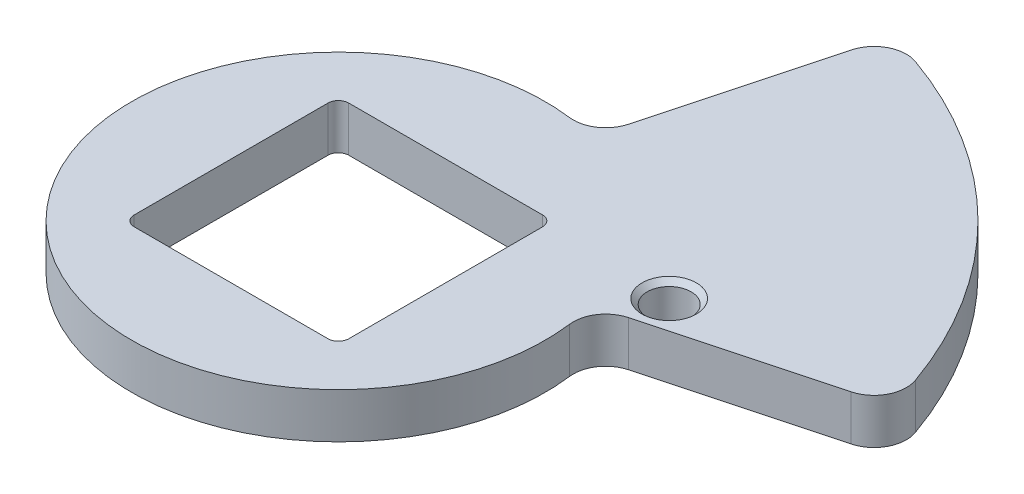
ISO-10303-21;
HEADER;
FILE_DESCRIPTION(('STEP AP214'),'2;1');
FILE_NAME('part.step','',(''),(''),'','','');
FILE_SCHEMA(('AUTOMOTIVE_DESIGN { 1 0 10303 214 1 1 1 1 }'));
ENDSEC;
DATA;
#1=APPLICATION_CONTEXT('core data for automotive mechanical design processes');
#2=APPLICATION_PROTOCOL_DEFINITION('international standard','automotive_design',2000,#1);
#3=PRODUCT_CONTEXT('',#1,'mechanical');
#4=PRODUCT('Part','Part','',(#3));
#5=PRODUCT_RELATED_PRODUCT_CATEGORY('part','',(#4));
#6=PRODUCT_DEFINITION_FORMATION('','',#4);
#7=PRODUCT_DEFINITION_CONTEXT('part definition',#1,'design');
#8=PRODUCT_DEFINITION('design','',#6,#7);
#9=PRODUCT_DEFINITION_SHAPE('','',#8);
#10=(LENGTH_UNIT() NAMED_UNIT(*) SI_UNIT(.MILLI.,.METRE.));
#11=(NAMED_UNIT(*) PLANE_ANGLE_UNIT() SI_UNIT($,.RADIAN.));
#12=(NAMED_UNIT(*) SI_UNIT($,.STERADIAN.) SOLID_ANGLE_UNIT());
#13=UNCERTAINTY_MEASURE_WITH_UNIT(LENGTH_MEASURE(1.E-05),#10,'distance_accuracy_value','');
#14=(GEOMETRIC_REPRESENTATION_CONTEXT(3) GLOBAL_UNCERTAINTY_ASSIGNED_CONTEXT((#13)) GLOBAL_UNIT_ASSIGNED_CONTEXT((#10,
#11,#12)) REPRESENTATION_CONTEXT('',''));
#15=CARTESIAN_POINT('',(0.,0.,0.));
#16=DIRECTION('',(0.,0.,1.));
#17=DIRECTION('',(1.,0.,0.));
#18=AXIS2_PLACEMENT_3D('',#15,#16,#17);
#19=CARTESIAN_POINT('',(0.,4.445,0.));
#20=DIRECTION('',(0.,-1.,0.));
#21=DIRECTION('',(0.,0.,-1.));
#22=AXIS2_PLACEMENT_3D('',#19,#20,#21);
#23=PLANE('',#22);
#24=CARTESIAN_POINT('',(22.86,4.445,-9.652));
#25=DIRECTION('',(0.,-1.,0.));
#26=DIRECTION('',(0.,0.,-1.));
#27=AXIS2_PLACEMENT_3D('',#24,#25,#26);
#28=CIRCLE('',#27,2.66700000000002);
#29=CARTESIAN_POINT('',(22.86,4.445,-12.319));
#30=VERTEX_POINT('',#29);
#31=EDGE_CURVE('E11',#30,#30,#28,.T.);
#32=ORIENTED_EDGE('',*,*,#31,.T.);
#33=EDGE_LOOP('',(#32));
#34=FACE_BOUND('',#33,.T.);
#35=CARTESIAN_POINT('',(0.,4.445,0.));
#36=DIRECTION('',(0.,1.,0.));
#37=DIRECTION('',(0.,0.,-1.));
#38=AXIS2_PLACEMENT_3D('',#35,#36,#37);
#39=CIRCLE('',#38,44.45);
#40=CARTESIAN_POINT('',(41.9232246474188,4.445,-14.773142359094));
#41=VERTEX_POINT('',#40);
#42=CARTESIAN_POINT('',(14.7731423590938,4.445,-41.9232246474188));
#43=VERTEX_POINT('',#42);
#44=EDGE_CURVE('E190',#41,#43,#39,.T.);
#45=ORIENTED_EDGE('',*,*,#44,.T.);
#46=CARTESIAN_POINT('',(13.7179179048728,4.445,-38.9287086011747));
#47=DIRECTION('',(0.,-1.,0.));
#48=DIRECTION('',(0.,0.,-1.));
#49=AXIS2_PLACEMENT_3D('',#46,#47,#48);
#50=CIRCLE('',#49,3.175);
#51=CARTESIAN_POINT('',(10.651103406405,4.445,-39.7504590693751));
#52=VERTEX_POINT('',#51);
#53=EDGE_CURVE('E199',#43,#52,#50,.F.);
#54=ORIENTED_EDGE('',*,*,#53,.T.);
#55=DIRECTION('',(-0.258819045102511,0.,0.965925826289071));
#56=VECTOR('',#55,1.);
#57=CARTESIAN_POINT('',(11.5045065548066,4.445,-42.9354029785492));
#58=LINE('',#57,#56);
#59=CARTESIAN_POINT('',(6.0251739566305,4.445,-22.4862553305868));
#60=VERTEX_POINT('',#59);
#61=EDGE_CURVE('E172',#52,#60,#58,.T.);
#62=ORIENTED_EDGE('',*,*,#61,.T.);
#63=CARTESIAN_POINT('',(2.9583594581627,4.445,-23.3080057987872));
#64=DIRECTION('',(0.,-1.,0.));
#65=DIRECTION('',(0.,0.,-1.));
#66=AXIS2_PLACEMENT_3D('',#63,#64,#65);
#67=CIRCLE('',#66,3.175);
#68=CARTESIAN_POINT('',(2.55858115300558,4.445,-20.1582752854376));
#69=VERTEX_POINT('',#68);
#70=EDGE_CURVE('E212',#60,#69,#67,.T.);
#71=ORIENTED_EDGE('',*,*,#70,.T.);
#72=CARTESIAN_POINT('',(0.,4.445,0.));
#73=DIRECTION('',(0.,1.,0.));
#74=DIRECTION('',(0.,0.,1.));
#75=AXIS2_PLACEMENT_3D('',#72,#73,#74);
#76=CIRCLE('',#75,20.32);
#77=CARTESIAN_POINT('',(20.1582752854376,4.445,-2.55858115300565));
#78=VERTEX_POINT('',#77);
#79=EDGE_CURVE('E290',#69,#78,#76,.T.);
#80=ORIENTED_EDGE('',*,*,#79,.T.);
#81=CARTESIAN_POINT('',(23.3080057987872,4.445,-2.95835945816279));
#82=DIRECTION('',(0.,-1.,0.));
#83=DIRECTION('',(0.,0.,-1.));
#84=AXIS2_PLACEMENT_3D('',#81,#82,#83);
#85=CIRCLE('',#84,3.175);
#86=CARTESIAN_POINT('',(22.4862553305867,4.445,-6.02517395663058));
#87=VERTEX_POINT('',#86);
#88=EDGE_CURVE('E216',#78,#87,#85,.T.);
#89=ORIENTED_EDGE('',*,*,#88,.T.);
#90=DIRECTION('',(0.96592582628907,0.,-0.258819045102515));
#91=VECTOR('',#90,1.);
#92=CARTESIAN_POINT('',(42.9354029785491,4.445,-11.5045065548068));
#93=LINE('',#92,#91);
#94=CARTESIAN_POINT('',(39.7504590693751,4.445,-10.6511034064052));
#95=VERTEX_POINT('',#94);
#96=EDGE_CURVE('E191',#87,#95,#93,.T.);
#97=ORIENTED_EDGE('',*,*,#96,.T.);
#98=CARTESIAN_POINT('',(38.9287086011746,4.445,-13.717917904873));
#99=DIRECTION('',(0.,-1.,0.));
#100=DIRECTION('',(0.,0.,-1.));
#101=AXIS2_PLACEMENT_3D('',#98,#99,#100);
#102=CIRCLE('',#101,3.175);
#103=EDGE_CURVE('E197',#95,#41,#102,.F.);
#104=ORIENTED_EDGE('',*,*,#103,.T.);
#105=EDGE_LOOP('',(#45,#54,#62,#71,#80,#89,#97,#104));
#106=FACE_BOUND('',#105,.T.);
#107=DIRECTION('',(0.,0.,-1.));
#108=VECTOR('',#107,1.);
#109=CARTESIAN_POINT('',(10.541,4.445,10.541));
#110=LINE('',#109,#108);
#111=CARTESIAN_POINT('',(10.541,4.445,9.525));
#112=VERTEX_POINT('',#111);
#113=CARTESIAN_POINT('',(10.541,4.445,-9.525));
#114=VERTEX_POINT('',#113);
#115=EDGE_CURVE('E281',#112,#114,#110,.T.);
#116=ORIENTED_EDGE('',*,*,#115,.F.);
#117=CARTESIAN_POINT('',(9.525,4.445,9.525));
#118=DIRECTION('',(0.,-1.,0.));
#119=DIRECTION('',(0.,0.,-1.));
#120=AXIS2_PLACEMENT_3D('',#117,#118,#119);
#121=CIRCLE('',#120,1.016);
#122=CARTESIAN_POINT('',(9.525,4.445,10.541));
#123=VERTEX_POINT('',#122);
#124=EDGE_CURVE('E243',#112,#123,#121,.T.);
#125=ORIENTED_EDGE('',*,*,#124,.T.);
#126=DIRECTION('',(1.,0.,0.));
#127=VECTOR('',#126,1.);
#128=CARTESIAN_POINT('',(-10.541,4.445,10.541));
#129=LINE('',#128,#127);
#130=CARTESIAN_POINT('',(-9.525,4.445,10.541));
#131=VERTEX_POINT('',#130);
#132=EDGE_CURVE('E184',#131,#123,#129,.T.);
#133=ORIENTED_EDGE('',*,*,#132,.F.);
#134=CARTESIAN_POINT('',(-9.525,4.445,9.525));
#135=DIRECTION('',(0.,-1.,0.));
#136=DIRECTION('',(0.,0.,-1.));
#137=AXIS2_PLACEMENT_3D('',#134,#135,#136);
#138=CIRCLE('',#137,1.016);
#139=CARTESIAN_POINT('',(-10.541,4.445,9.525));
#140=VERTEX_POINT('',#139);
#141=EDGE_CURVE('E52',#131,#140,#138,.T.);
#142=ORIENTED_EDGE('',*,*,#141,.T.);
#143=DIRECTION('',(0.,0.,1.));
#144=VECTOR('',#143,1.);
#145=CARTESIAN_POINT('',(-10.541,4.445,10.541));
#146=LINE('',#145,#144);
#147=CARTESIAN_POINT('',(-10.541,4.445,-9.525));
#148=VERTEX_POINT('',#147);
#149=EDGE_CURVE('E380',#148,#140,#146,.T.);
#150=ORIENTED_EDGE('',*,*,#149,.F.);
#151=CARTESIAN_POINT('',(-9.525,4.445,-9.525));
#152=DIRECTION('',(0.,-1.,0.));
#153=DIRECTION('',(0.,0.,-1.));
#154=AXIS2_PLACEMENT_3D('',#151,#152,#153);
#155=CIRCLE('',#154,1.016);
#156=CARTESIAN_POINT('',(-9.525,4.445,-10.541));
#157=VERTEX_POINT('',#156);
#158=EDGE_CURVE('E250',#148,#157,#155,.T.);
#159=ORIENTED_EDGE('',*,*,#158,.T.);
#160=DIRECTION('',(-1.,0.,0.));
#161=VECTOR('',#160,1.);
#162=CARTESIAN_POINT('',(-10.541,4.445,-10.541));
#163=LINE('',#162,#161);
#164=CARTESIAN_POINT('',(9.525,4.445,-10.541));
#165=VERTEX_POINT('',#164);
#166=EDGE_CURVE('E375',#165,#157,#163,.T.);
#167=ORIENTED_EDGE('',*,*,#166,.F.);
#168=CARTESIAN_POINT('',(9.525,4.445,-9.525));
#169=DIRECTION('',(0.,-1.,0.));
#170=DIRECTION('',(0.,0.,-1.));
#171=AXIS2_PLACEMENT_3D('',#168,#169,#170);
#172=CIRCLE('',#171,1.016);
#173=EDGE_CURVE('E239',#165,#114,#172,.T.);
#174=ORIENTED_EDGE('',*,*,#173,.T.);
#175=EDGE_LOOP('',(#116,#125,#133,#142,#150,#159,#167,#174));
#176=FACE_BOUND('',#175,.T.);
#177=ADVANCED_FACE('F37',(#34,#106,#176),#23,.F.);
#178=CARTESIAN_POINT('',(0.,0.,0.));
#179=DIRECTION('',(0.,-1.,0.));
#180=DIRECTION('',(0.,0.,-1.));
#181=AXIS2_PLACEMENT_3D('',#178,#179,#180);
#182=PLANE('',#181);
#183=CARTESIAN_POINT('',(22.86,0.,-9.652));
#184=DIRECTION('',(0.,-1.,0.));
#185=DIRECTION('',(0.,0.,-1.));
#186=AXIS2_PLACEMENT_3D('',#183,#184,#185);
#187=CIRCLE('',#186,2.66699999999998);
#188=CARTESIAN_POINT('',(22.86,0.,-12.319));
#189=VERTEX_POINT('',#188);
#190=EDGE_CURVE('E252',#189,#189,#187,.F.);
#191=ORIENTED_EDGE('',*,*,#190,.T.);
#192=EDGE_LOOP('',(#191));
#193=FACE_BOUND('',#192,.T.);
#194=DIRECTION('',(0.,0.,1.));
#195=VECTOR('',#194,1.);
#196=CARTESIAN_POINT('',(-10.541,0.,10.541));
#197=LINE('',#196,#195);
#198=CARTESIAN_POINT('',(-10.541,0.,-9.525));
#199=VERTEX_POINT('',#198);
#200=CARTESIAN_POINT('',(-10.541,0.,9.525));
#201=VERTEX_POINT('',#200);
#202=EDGE_CURVE('E274',#199,#201,#197,.T.);
#203=ORIENTED_EDGE('',*,*,#202,.T.);
#204=CARTESIAN_POINT('',(-9.525,0.,9.525));
#205=DIRECTION('',(0.,-1.,0.));
#206=DIRECTION('',(0.,0.,-1.));
#207=AXIS2_PLACEMENT_3D('',#204,#205,#206);
#208=CIRCLE('',#207,1.016);
#209=CARTESIAN_POINT('',(-9.525,0.,10.541));
#210=VERTEX_POINT('',#209);
#211=EDGE_CURVE('E245',#201,#210,#208,.F.);
#212=ORIENTED_EDGE('',*,*,#211,.T.);
#213=DIRECTION('',(1.,0.,0.));
#214=VECTOR('',#213,1.);
#215=CARTESIAN_POINT('',(-10.541,0.,10.541));
#216=LINE('',#215,#214);
#217=CARTESIAN_POINT('',(9.525,0.,10.541));
#218=VERTEX_POINT('',#217);
#219=EDGE_CURVE('E278',#210,#218,#216,.T.);
#220=ORIENTED_EDGE('',*,*,#219,.T.);
#221=CARTESIAN_POINT('',(9.525,0.,9.525));
#222=DIRECTION('',(0.,-1.,0.));
#223=DIRECTION('',(0.,0.,-1.));
#224=AXIS2_PLACEMENT_3D('',#221,#222,#223);
#225=CIRCLE('',#224,1.016);
#226=CARTESIAN_POINT('',(10.541,0.,9.525));
#227=VERTEX_POINT('',#226);
#228=EDGE_CURVE('E241',#218,#227,#225,.F.);
#229=ORIENTED_EDGE('',*,*,#228,.T.);
#230=DIRECTION('',(0.,0.,-1.));
#231=VECTOR('',#230,1.);
#232=CARTESIAN_POINT('',(10.541,0.,10.541));
#233=LINE('',#232,#231);
#234=CARTESIAN_POINT('',(10.541,0.,-9.525));
#235=VERTEX_POINT('',#234);
#236=EDGE_CURVE('E283',#227,#235,#233,.T.);
#237=ORIENTED_EDGE('',*,*,#236,.T.);
#238=CARTESIAN_POINT('',(9.525,0.,-9.525));
#239=DIRECTION('',(0.,-1.,0.));
#240=DIRECTION('',(0.,0.,-1.));
#241=AXIS2_PLACEMENT_3D('',#238,#239,#240);
#242=CIRCLE('',#241,1.016);
#243=CARTESIAN_POINT('',(9.525,0.,-10.541));
#244=VERTEX_POINT('',#243);
#245=EDGE_CURVE('E237',#235,#244,#242,.F.);
#246=ORIENTED_EDGE('',*,*,#245,.T.);
#247=DIRECTION('',(-1.,0.,0.));
#248=VECTOR('',#247,1.);
#249=CARTESIAN_POINT('',(-10.541,0.,-10.541));
#250=LINE('',#249,#248);
#251=CARTESIAN_POINT('',(-9.525,0.,-10.541));
#252=VERTEX_POINT('',#251);
#253=EDGE_CURVE('E279',#244,#252,#250,.T.);
#254=ORIENTED_EDGE('',*,*,#253,.T.);
#255=CARTESIAN_POINT('',(-9.525,0.,-9.525));
#256=DIRECTION('',(0.,-1.,0.));
#257=DIRECTION('',(0.,0.,-1.));
#258=AXIS2_PLACEMENT_3D('',#255,#256,#257);
#259=CIRCLE('',#258,1.016);
#260=EDGE_CURVE('E248',#252,#199,#259,.F.);
#261=ORIENTED_EDGE('',*,*,#260,.T.);
#262=EDGE_LOOP('',(#203,#212,#220,#229,#237,#246,#254,#261));
#263=FACE_BOUND('',#262,.T.);
#264=DIRECTION('',(-0.258819045102511,0.,0.965925826289071));
#265=VECTOR('',#264,1.);
#266=CARTESIAN_POINT('',(11.5045065548066,0.,-42.9354029785492));
#267=LINE('',#266,#265);
#268=CARTESIAN_POINT('',(10.651103406405,0.,-39.7504590693751));
#269=VERTEX_POINT('',#268);
#270=CARTESIAN_POINT('',(6.0251739566305,0.,-22.4862553305868));
#271=VERTEX_POINT('',#270);
#272=EDGE_CURVE('E169',#269,#271,#267,.T.);
#273=ORIENTED_EDGE('',*,*,#272,.F.);
#274=CARTESIAN_POINT('',(13.7179179048728,0.,-38.9287086011747));
#275=DIRECTION('',(0.,-1.,0.));
#276=DIRECTION('',(0.,0.,-1.));
#277=AXIS2_PLACEMENT_3D('',#274,#275,#276);
#278=CIRCLE('',#277,3.175);
#279=CARTESIAN_POINT('',(14.7731423590938,0.,-41.9232246474188));
#280=VERTEX_POINT('',#279);
#281=EDGE_CURVE('E152',#269,#280,#278,.T.);
#282=ORIENTED_EDGE('',*,*,#281,.T.);
#283=CARTESIAN_POINT('',(0.,0.,0.));
#284=DIRECTION('',(0.,1.,0.));
#285=DIRECTION('',(0.,0.,-1.));
#286=AXIS2_PLACEMENT_3D('',#283,#284,#285);
#287=CIRCLE('',#286,44.45);
#288=CARTESIAN_POINT('',(41.9232246474188,0.,-14.773142359094));
#289=VERTEX_POINT('',#288);
#290=EDGE_CURVE('E179',#289,#280,#287,.T.);
#291=ORIENTED_EDGE('',*,*,#290,.F.);
#292=CARTESIAN_POINT('',(38.9287086011746,0.,-13.717917904873));
#293=DIRECTION('',(0.,-1.,0.));
#294=DIRECTION('',(0.,0.,-1.));
#295=AXIS2_PLACEMENT_3D('',#292,#293,#294);
#296=CIRCLE('',#295,3.175);
#297=CARTESIAN_POINT('',(39.7504590693751,0.,-10.6511034064052));
#298=VERTEX_POINT('',#297);
#299=EDGE_CURVE('E163',#289,#298,#296,.T.);
#300=ORIENTED_EDGE('',*,*,#299,.T.);
#301=DIRECTION('',(0.96592582628907,0.,-0.258819045102515));
#302=VECTOR('',#301,1.);
#303=CARTESIAN_POINT('',(42.9354029785491,0.,-11.5045065548068));
#304=LINE('',#303,#302);
#305=CARTESIAN_POINT('',(22.4862553305867,0.,-6.02517395663058));
#306=VERTEX_POINT('',#305);
#307=EDGE_CURVE('E182',#306,#298,#304,.T.);
#308=ORIENTED_EDGE('',*,*,#307,.F.);
#309=CARTESIAN_POINT('',(23.3080057987872,0.,-2.95835945816279));
#310=DIRECTION('',(0.,-1.,0.));
#311=DIRECTION('',(0.,0.,-1.));
#312=AXIS2_PLACEMENT_3D('',#309,#310,#311);
#313=CIRCLE('',#312,3.175);
#314=CARTESIAN_POINT('',(20.1582752854376,0.,-2.55858115300565));
#315=VERTEX_POINT('',#314);
#316=EDGE_CURVE('E214',#306,#315,#313,.F.);
#317=ORIENTED_EDGE('',*,*,#316,.T.);
#318=CARTESIAN_POINT('',(0.,0.,0.));
#319=DIRECTION('',(0.,1.,0.));
#320=DIRECTION('',(0.,0.,1.));
#321=AXIS2_PLACEMENT_3D('',#318,#319,#320);
#322=CIRCLE('',#321,20.32);
#323=CARTESIAN_POINT('',(2.55858115300558,0.,-20.1582752854376));
#324=VERTEX_POINT('',#323);
#325=EDGE_CURVE('E178',#324,#315,#322,.T.);
#326=ORIENTED_EDGE('',*,*,#325,.F.);
#327=CARTESIAN_POINT('',(2.9583594581627,0.,-23.3080057987872));
#328=DIRECTION('',(0.,-1.,0.));
#329=DIRECTION('',(0.,0.,-1.));
#330=AXIS2_PLACEMENT_3D('',#327,#328,#329);
#331=CIRCLE('',#330,3.175);
#332=EDGE_CURVE('E177',#324,#271,#331,.F.);
#333=ORIENTED_EDGE('',*,*,#332,.T.);
#334=EDGE_LOOP('',(#273,#282,#291,#300,#308,#317,#326,#333));
#335=FACE_BOUND('',#334,.T.);
#336=ADVANCED_FACE('F175',(#193,#263,#335),#182,.T.);
#337=CARTESIAN_POINT('',(0.,4.445,0.));
#338=DIRECTION('',(0.,-1.,0.));
#339=DIRECTION('',(0.,0.,-1.));
#340=AXIS2_PLACEMENT_3D('',#337,#338,#339);
#341=CYLINDRICAL_SURFACE('',#340,44.45);
#342=ORIENTED_EDGE('',*,*,#290,.T.);
#343=DIRECTION('',(0.,-1.,0.));
#344=VECTOR('',#343,1.);
#345=CARTESIAN_POINT('',(14.7731423590938,4.445,-41.9232246474189));
#346=LINE('',#345,#344);
#347=EDGE_CURVE('E157',#280,#43,#346,.F.);
#348=ORIENTED_EDGE('',*,*,#347,.T.);
#349=ORIENTED_EDGE('',*,*,#44,.F.);
#350=DIRECTION('',(0.,-1.,0.));
#351=VECTOR('',#350,1.);
#352=CARTESIAN_POINT('',(41.9232246474188,4.445,-14.773142359094));
#353=LINE('',#352,#351);
#354=EDGE_CURVE('E162',#41,#289,#353,.T.);
#355=ORIENTED_EDGE('',*,*,#354,.T.);
#356=EDGE_LOOP('',(#342,#348,#349,#355));
#357=FACE_BOUND('',#356,.T.);
#358=ADVANCED_FACE('F271',(#357),#341,.T.);
#359=CARTESIAN_POINT('',(11.5045065548066,4.445,-42.9354029785492));
#360=DIRECTION('',(0.965925826289071,0.,0.258819045102511));
#361=DIRECTION('',(0.258819045102511,0.,-0.965925826289071));
#362=AXIS2_PLACEMENT_3D('',#359,#360,#361);
#363=PLANE('',#362);
#364=ORIENTED_EDGE('',*,*,#61,.F.);
#365=DIRECTION('',(0.,-1.,0.));
#366=VECTOR('',#365,1.);
#367=CARTESIAN_POINT('',(10.651103406405,4.445,-39.7504590693751));
#368=LINE('',#367,#366);
#369=EDGE_CURVE('E156',#52,#269,#368,.T.);
#370=ORIENTED_EDGE('',*,*,#369,.T.);
#371=ORIENTED_EDGE('',*,*,#272,.T.);
#372=DIRECTION('',(0.,1.,0.));
#373=VECTOR('',#372,1.);
#374=CARTESIAN_POINT('',(6.0251739566305,4.445,-22.4862553305868));
#375=LINE('',#374,#373);
#376=EDGE_CURVE('E173',#271,#60,#375,.T.);
#377=ORIENTED_EDGE('',*,*,#376,.T.);
#378=EDGE_LOOP('',(#364,#370,#371,#377));
#379=FACE_BOUND('',#378,.T.);
#380=ADVANCED_FACE('F168',(#379),#363,.F.);
#381=CARTESIAN_POINT('',(0.,4.445,0.));
#382=DIRECTION('',(0.,-1.,0.));
#383=DIRECTION('',(0.,0.,-1.));
#384=AXIS2_PLACEMENT_3D('',#381,#382,#383);
#385=CYLINDRICAL_SURFACE('',#384,20.32);
#386=ORIENTED_EDGE('',*,*,#79,.F.);
#387=DIRECTION('',(0.,-1.,0.));
#388=VECTOR('',#387,1.);
#389=CARTESIAN_POINT('',(2.55858115300558,4.445,-20.1582752854376));
#390=LINE('',#389,#388);
#391=EDGE_CURVE('E208',#69,#324,#390,.T.);
#392=ORIENTED_EDGE('',*,*,#391,.T.);
#393=ORIENTED_EDGE('',*,*,#325,.T.);
#394=DIRECTION('',(0.,-1.,0.));
#395=VECTOR('',#394,1.);
#396=CARTESIAN_POINT('',(20.1582752854376,4.445,-2.55858115300565));
#397=LINE('',#396,#395);
#398=EDGE_CURVE('E206',#315,#78,#397,.F.);
#399=ORIENTED_EDGE('',*,*,#398,.T.);
#400=EDGE_LOOP('',(#386,#392,#393,#399));
#401=FACE_BOUND('',#400,.T.);
#402=ADVANCED_FACE('F312',(#401),#385,.T.);
#403=CARTESIAN_POINT('',(42.9354029785491,4.445,-11.5045065548068));
#404=DIRECTION('',(-0.258819045102515,0.,-0.96592582628907));
#405=DIRECTION('',(-0.96592582628907,0.,0.258819045102515));
#406=AXIS2_PLACEMENT_3D('',#403,#404,#405);
#407=PLANE('',#406);
#408=ORIENTED_EDGE('',*,*,#307,.T.);
#409=DIRECTION('',(0.,-1.,0.));
#410=VECTOR('',#409,1.);
#411=CARTESIAN_POINT('',(39.7504590693751,4.445,-10.6511034064052));
#412=LINE('',#411,#410);
#413=EDGE_CURVE('E204',#298,#95,#412,.F.);
#414=ORIENTED_EDGE('',*,*,#413,.T.);
#415=ORIENTED_EDGE('',*,*,#96,.F.);
#416=DIRECTION('',(0.,1.,0.));
#417=VECTOR('',#416,1.);
#418=CARTESIAN_POINT('',(22.4862553305867,0.,-6.02517395663058));
#419=LINE('',#418,#417);
#420=EDGE_CURVE('E201',#87,#306,#419,.F.);
#421=ORIENTED_EDGE('',*,*,#420,.T.);
#422=EDGE_LOOP('',(#408,#414,#415,#421));
#423=FACE_BOUND('',#422,.T.);
#424=ADVANCED_FACE('F306',(#423),#407,.F.);
#425=CARTESIAN_POINT('',(10.541,4.445,10.541));
#426=DIRECTION('',(-1.,0.,0.));
#427=DIRECTION('',(0.,0.,1.));
#428=AXIS2_PLACEMENT_3D('',#425,#426,#427);
#429=PLANE('',#428);
#430=ORIENTED_EDGE('',*,*,#115,.T.);
#431=DIRECTION('',(0.,-1.,0.));
#432=VECTOR('',#431,1.);
#433=CARTESIAN_POINT('',(10.541,0.,-9.525));
#434=LINE('',#433,#432);
#435=EDGE_CURVE('E220',#114,#235,#434,.T.);
#436=ORIENTED_EDGE('',*,*,#435,.T.);
#437=ORIENTED_EDGE('',*,*,#236,.F.);
#438=DIRECTION('',(0.,-1.,0.));
#439=VECTOR('',#438,1.);
#440=CARTESIAN_POINT('',(10.541,4.445,9.525));
#441=LINE('',#440,#439);
#442=EDGE_CURVE('E218',#227,#112,#441,.F.);
#443=ORIENTED_EDGE('',*,*,#442,.T.);
#444=EDGE_LOOP('',(#430,#436,#437,#443));
#445=FACE_BOUND('',#444,.T.);
#446=ADVANCED_FACE('F332',(#445),#429,.T.);
#447=CARTESIAN_POINT('',(-10.541,4.445,-10.541));
#448=DIRECTION('',(0.,0.,1.));
#449=DIRECTION('',(1.,0.,0.));
#450=AXIS2_PLACEMENT_3D('',#447,#448,#449);
#451=PLANE('',#450);
#452=ORIENTED_EDGE('',*,*,#253,.F.);
#453=DIRECTION('',(0.,-1.,0.));
#454=VECTOR('',#453,1.);
#455=CARTESIAN_POINT('',(9.525,4.445,-10.541));
#456=LINE('',#455,#454);
#457=EDGE_CURVE('E226',#244,#165,#456,.F.);
#458=ORIENTED_EDGE('',*,*,#457,.T.);
#459=ORIENTED_EDGE('',*,*,#166,.T.);
#460=DIRECTION('',(0.,-1.,0.));
#461=VECTOR('',#460,1.);
#462=CARTESIAN_POINT('',(-9.525,0.,-10.541));
#463=LINE('',#462,#461);
#464=EDGE_CURVE('E223',#157,#252,#463,.T.);
#465=ORIENTED_EDGE('',*,*,#464,.T.);
#466=EDGE_LOOP('',(#452,#458,#459,#465));
#467=FACE_BOUND('',#466,.T.);
#468=ADVANCED_FACE('F357',(#467),#451,.T.);
#469=CARTESIAN_POINT('',(-10.541,4.445,10.541));
#470=DIRECTION('',(1.,0.,0.));
#471=DIRECTION('',(0.,0.,-1.));
#472=AXIS2_PLACEMENT_3D('',#469,#470,#471);
#473=PLANE('',#472);
#474=ORIENTED_EDGE('',*,*,#149,.T.);
#475=DIRECTION('',(0.,-1.,0.));
#476=VECTOR('',#475,1.);
#477=CARTESIAN_POINT('',(-10.541,0.,9.525));
#478=LINE('',#477,#476);
#479=EDGE_CURVE('E234',#140,#201,#478,.T.);
#480=ORIENTED_EDGE('',*,*,#479,.T.);
#481=ORIENTED_EDGE('',*,*,#202,.F.);
#482=DIRECTION('',(0.,-1.,0.));
#483=VECTOR('',#482,1.);
#484=CARTESIAN_POINT('',(-10.541,4.445,-9.525));
#485=LINE('',#484,#483);
#486=EDGE_CURVE('E59',#199,#148,#485,.F.);
#487=ORIENTED_EDGE('',*,*,#486,.T.);
#488=EDGE_LOOP('',(#474,#480,#481,#487));
#489=FACE_BOUND('',#488,.T.);
#490=ADVANCED_FACE('F352',(#489),#473,.T.);
#491=CARTESIAN_POINT('',(-10.541,4.445,10.541));
#492=DIRECTION('',(0.,0.,-1.));
#493=DIRECTION('',(-1.,0.,0.));
#494=AXIS2_PLACEMENT_3D('',#491,#492,#493);
#495=PLANE('',#494);
#496=ORIENTED_EDGE('',*,*,#132,.T.);
#497=DIRECTION('',(0.,-1.,0.));
#498=VECTOR('',#497,1.);
#499=CARTESIAN_POINT('',(9.525,0.,10.541));
#500=LINE('',#499,#498);
#501=EDGE_CURVE('E230',#123,#218,#500,.T.);
#502=ORIENTED_EDGE('',*,*,#501,.T.);
#503=ORIENTED_EDGE('',*,*,#219,.F.);
#504=DIRECTION('',(0.,-1.,0.));
#505=VECTOR('',#504,1.);
#506=CARTESIAN_POINT('',(-9.525,4.445,10.541));
#507=LINE('',#506,#505);
#508=EDGE_CURVE('E228',#210,#131,#507,.F.);
#509=ORIENTED_EDGE('',*,*,#508,.T.);
#510=EDGE_LOOP('',(#496,#502,#503,#509));
#511=FACE_BOUND('',#510,.T.);
#512=ADVANCED_FACE('F347',(#511),#495,.T.);
#513=CARTESIAN_POINT('',(22.86,4.445,-9.652));
#514=DIRECTION('',(0.,-1.,0.));
#515=DIRECTION('',(0.,0.,-1.));
#516=AXIS2_PLACEMENT_3D('',#513,#514,#515);
#517=CYLINDRICAL_SURFACE('',#516,2.159);
#518=CARTESIAN_POINT('',(22.86,0.507999999999994,-9.652));
#519=DIRECTION('',(0.,-1.,0.));
#520=DIRECTION('',(0.,0.,-1.));
#521=AXIS2_PLACEMENT_3D('',#518,#519,#520);
#522=CIRCLE('',#521,2.159);
#523=CARTESIAN_POINT('',(22.86,0.507999999999994,-11.811));
#524=VERTEX_POINT('',#523);
#525=EDGE_CURVE('E45',#524,#524,#522,.T.);
#526=ORIENTED_EDGE('',*,*,#525,.T.);
#527=EDGE_LOOP('',(#526));
#528=FACE_BOUND('',#527,.T.);
#529=CARTESIAN_POINT('',(22.86,3.93699999999999,-9.652));
#530=DIRECTION('',(0.,-1.,0.));
#531=DIRECTION('',(0.,0.,-1.));
#532=AXIS2_PLACEMENT_3D('',#529,#530,#531);
#533=CIRCLE('',#532,2.159);
#534=CARTESIAN_POINT('',(22.86,3.93699999999999,-11.811));
#535=VERTEX_POINT('',#534);
#536=EDGE_CURVE('E255',#535,#535,#533,.F.);
#537=ORIENTED_EDGE('',*,*,#536,.T.);
#538=EDGE_LOOP('',(#537));
#539=FACE_BOUND('',#538,.T.);
#540=ADVANCED_FACE('F260',(#528,#539),#517,.F.);
#541=CARTESIAN_POINT('',(13.7179179048728,4.445,-38.9287086011747));
#542=DIRECTION('',(0.,-1.,0.));
#543=DIRECTION('',(0.,0.,-1.));
#544=AXIS2_PLACEMENT_3D('',#541,#542,#543);
#545=CYLINDRICAL_SURFACE('',#544,3.175);
#546=ORIENTED_EDGE('',*,*,#53,.F.);
#547=ORIENTED_EDGE('',*,*,#347,.F.);
#548=ORIENTED_EDGE('',*,*,#281,.F.);
#549=ORIENTED_EDGE('',*,*,#369,.F.);
#550=EDGE_LOOP('',(#546,#547,#548,#549));
#551=FACE_BOUND('',#550,.T.);
#552=ADVANCED_FACE('F155',(#551),#545,.T.);
#553=CARTESIAN_POINT('',(38.9287086011746,4.445,-13.717917904873));
#554=DIRECTION('',(0.,-1.,0.));
#555=DIRECTION('',(0.,0.,-1.));
#556=AXIS2_PLACEMENT_3D('',#553,#554,#555);
#557=CYLINDRICAL_SURFACE('',#556,3.175);
#558=ORIENTED_EDGE('',*,*,#103,.F.);
#559=ORIENTED_EDGE('',*,*,#413,.F.);
#560=ORIENTED_EDGE('',*,*,#299,.F.);
#561=ORIENTED_EDGE('',*,*,#354,.F.);
#562=EDGE_LOOP('',(#558,#559,#560,#561));
#563=FACE_BOUND('',#562,.T.);
#564=ADVANCED_FACE('F303',(#563),#557,.T.);
#565=CARTESIAN_POINT('',(2.9583594581627,4.445,-23.3080057987872));
#566=DIRECTION('',(0.,-1.,0.));
#567=DIRECTION('',(0.,0.,-1.));
#568=AXIS2_PLACEMENT_3D('',#565,#566,#567);
#569=CYLINDRICAL_SURFACE('',#568,3.175);
#570=ORIENTED_EDGE('',*,*,#70,.F.);
#571=ORIENTED_EDGE('',*,*,#376,.F.);
#572=ORIENTED_EDGE('',*,*,#332,.F.);
#573=ORIENTED_EDGE('',*,*,#391,.F.);
#574=EDGE_LOOP('',(#570,#571,#572,#573));
#575=FACE_BOUND('',#574,.T.);
#576=ADVANCED_FACE('F316',(#575),#569,.F.);
#577=CARTESIAN_POINT('',(23.3080057987872,4.445,-2.95835945816279));
#578=DIRECTION('',(0.,-1.,0.));
#579=DIRECTION('',(0.,0.,-1.));
#580=AXIS2_PLACEMENT_3D('',#577,#578,#579);
#581=CYLINDRICAL_SURFACE('',#580,3.175);
#582=ORIENTED_EDGE('',*,*,#88,.F.);
#583=ORIENTED_EDGE('',*,*,#398,.F.);
#584=ORIENTED_EDGE('',*,*,#316,.F.);
#585=ORIENTED_EDGE('',*,*,#420,.F.);
#586=EDGE_LOOP('',(#582,#583,#584,#585));
#587=FACE_BOUND('',#586,.T.);
#588=ADVANCED_FACE('F308',(#587),#581,.F.);
#589=CARTESIAN_POINT('',(9.525,4.445,-9.525));
#590=DIRECTION('',(0.,1.,0.));
#591=DIRECTION('',(0.,0.,1.));
#592=AXIS2_PLACEMENT_3D('',#589,#590,#591);
#593=CYLINDRICAL_SURFACE('',#592,1.016);
#594=ORIENTED_EDGE('',*,*,#173,.F.);
#595=ORIENTED_EDGE('',*,*,#457,.F.);
#596=ORIENTED_EDGE('',*,*,#245,.F.);
#597=ORIENTED_EDGE('',*,*,#435,.F.);
#598=EDGE_LOOP('',(#594,#595,#596,#597));
#599=FACE_BOUND('',#598,.T.);
#600=ADVANCED_FACE('F323',(#599),#593,.F.);
#601=CARTESIAN_POINT('',(9.525,4.445,9.525));
#602=DIRECTION('',(0.,1.,0.));
#603=DIRECTION('',(0.,0.,1.));
#604=AXIS2_PLACEMENT_3D('',#601,#602,#603);
#605=CYLINDRICAL_SURFACE('',#604,1.016);
#606=ORIENTED_EDGE('',*,*,#124,.F.);
#607=ORIENTED_EDGE('',*,*,#442,.F.);
#608=ORIENTED_EDGE('',*,*,#228,.F.);
#609=ORIENTED_EDGE('',*,*,#501,.F.);
#610=EDGE_LOOP('',(#606,#607,#608,#609));
#611=FACE_BOUND('',#610,.T.);
#612=ADVANCED_FACE('F386',(#611),#605,.F.);
#613=CARTESIAN_POINT('',(-9.525,4.445,9.525));
#614=DIRECTION('',(0.,1.,0.));
#615=DIRECTION('',(0.,0.,1.));
#616=AXIS2_PLACEMENT_3D('',#613,#614,#615);
#617=CYLINDRICAL_SURFACE('',#616,1.016);
#618=ORIENTED_EDGE('',*,*,#141,.F.);
#619=ORIENTED_EDGE('',*,*,#508,.F.);
#620=ORIENTED_EDGE('',*,*,#211,.F.);
#621=ORIENTED_EDGE('',*,*,#479,.F.);
#622=EDGE_LOOP('',(#618,#619,#620,#621));
#623=FACE_BOUND('',#622,.T.);
#624=ADVANCED_FACE('F390',(#623),#617,.F.);
#625=CARTESIAN_POINT('',(-9.525,4.445,-9.525));
#626=DIRECTION('',(0.,1.,0.));
#627=DIRECTION('',(0.,0.,1.));
#628=AXIS2_PLACEMENT_3D('',#625,#626,#627);
#629=CYLINDRICAL_SURFACE('',#628,1.016);
#630=ORIENTED_EDGE('',*,*,#158,.F.);
#631=ORIENTED_EDGE('',*,*,#486,.F.);
#632=ORIENTED_EDGE('',*,*,#260,.F.);
#633=ORIENTED_EDGE('',*,*,#464,.F.);
#634=EDGE_LOOP('',(#630,#631,#632,#633));
#635=FACE_BOUND('',#634,.T.);
#636=ADVANCED_FACE('F266',(#635),#629,.F.);
#637=CARTESIAN_POINT('',(22.86,0.,-9.652));
#638=DIRECTION('',(0.,-1.,0.));
#639=DIRECTION('',(0.,0.,-1.));
#640=AXIS2_PLACEMENT_3D('',#637,#638,#639);
#641=CONICAL_SURFACE('',#640,2.66699999999998,0.785398163397436);
#642=ORIENTED_EDGE('',*,*,#525,.F.);
#643=EDGE_LOOP('',(#642));
#644=FACE_BOUND('',#643,.T.);
#645=ORIENTED_EDGE('',*,*,#190,.F.);
#646=EDGE_LOOP('',(#645));
#647=FACE_BOUND('',#646,.T.);
#648=ADVANCED_FACE('F263',(#644,#647),#641,.F.);
#649=CARTESIAN_POINT('',(22.86,3.93699999999999,-9.652));
#650=DIRECTION('',(0.,1.,0.));
#651=DIRECTION('',(0.,0.,1.));
#652=AXIS2_PLACEMENT_3D('',#649,#650,#651);
#653=CONICAL_SURFACE('',#652,2.159,0.785398163397454);
#654=ORIENTED_EDGE('',*,*,#31,.F.);
#655=EDGE_LOOP('',(#654));
#656=FACE_BOUND('',#655,.T.);
#657=ORIENTED_EDGE('',*,*,#536,.F.);
#658=EDGE_LOOP('',(#657));
#659=FACE_BOUND('',#658,.T.);
#660=ADVANCED_FACE('F39',(#656,#659),#653,.F.);
#661=CLOSED_SHELL('',(#177,#336,#358,#380,#402,#424,#446,#468,#490,#512,#540,#552,#564,#576,
#588,#600,#612,#624,#636,#648,#660));
#662=MANIFOLD_SOLID_BREP('B2',#661);
#663=ADVANCED_BREP_SHAPE_REPRESENTATION('',(#18,#662),#14);
#664=SHAPE_DEFINITION_REPRESENTATION(#9,#663);
ENDSEC;
END-ISO-10303-21;
